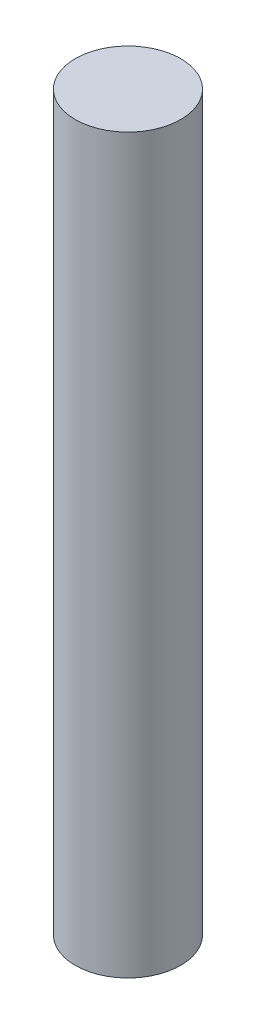
ISO-10303-21;
HEADER;
FILE_DESCRIPTION(('STEP AP214'),'2;1');
FILE_NAME('part.step','',(''),(''),'','','');
FILE_SCHEMA(('AUTOMOTIVE_DESIGN { 1 0 10303 214 1 1 1 1 }'));
ENDSEC;
DATA;
#1=APPLICATION_CONTEXT('core data for automotive mechanical design processes');
#2=APPLICATION_PROTOCOL_DEFINITION('international standard','automotive_design',2000,#1);
#3=PRODUCT_CONTEXT('',#1,'mechanical');
#4=PRODUCT('Part','Part','',(#3));
#5=PRODUCT_RELATED_PRODUCT_CATEGORY('part','',(#4));
#6=PRODUCT_DEFINITION_FORMATION('','',#4);
#7=PRODUCT_DEFINITION_CONTEXT('part definition',#1,'design');
#8=PRODUCT_DEFINITION('design','',#6,#7);
#9=PRODUCT_DEFINITION_SHAPE('','',#8);
#10=(LENGTH_UNIT() NAMED_UNIT(*) SI_UNIT(.MILLI.,.METRE.));
#11=(NAMED_UNIT(*) PLANE_ANGLE_UNIT() SI_UNIT($,.RADIAN.));
#12=(NAMED_UNIT(*) SI_UNIT($,.STERADIAN.) SOLID_ANGLE_UNIT());
#13=UNCERTAINTY_MEASURE_WITH_UNIT(LENGTH_MEASURE(1.E-05),#10,'distance_accuracy_value','');
#14=(GEOMETRIC_REPRESENTATION_CONTEXT(3) GLOBAL_UNCERTAINTY_ASSIGNED_CONTEXT((#13)) GLOBAL_UNIT_ASSIGNED_CONTEXT((#10,
#11,#12)) REPRESENTATION_CONTEXT('',''));
#15=CARTESIAN_POINT('',(0.,0.,0.));
#16=DIRECTION('',(0.,0.,1.));
#17=DIRECTION('',(1.,0.,0.));
#18=AXIS2_PLACEMENT_3D('',#15,#16,#17);
#19=CARTESIAN_POINT('',(0.,25.,0.));
#20=DIRECTION('',(0.,-1.,0.));
#21=DIRECTION('',(0.,0.,-1.));
#22=AXIS2_PLACEMENT_3D('',#19,#20,#21);
#23=CYLINDRICAL_SURFACE('',#22,1.8);
#24=CARTESIAN_POINT('',(0.,25.,0.));
#25=DIRECTION('',(0.,1.,0.));
#26=DIRECTION('',(0.,0.,1.));
#27=AXIS2_PLACEMENT_3D('',#24,#25,#26);
#28=CIRCLE('',#27,1.8);
#29=CARTESIAN_POINT('',(0.,25.,1.8));
#30=VERTEX_POINT('',#29);
#31=EDGE_CURVE('E10',#30,#30,#28,.T.);
#32=ORIENTED_EDGE('',*,*,#31,.F.);
#33=EDGE_LOOP('',(#32));
#34=FACE_BOUND('',#33,.T.);
#35=CARTESIAN_POINT('',(0.,0.,0.));
#36=DIRECTION('',(0.,1.,0.));
#37=DIRECTION('',(0.,0.,1.));
#38=AXIS2_PLACEMENT_3D('',#35,#36,#37);
#39=CIRCLE('',#38,1.8);
#40=CARTESIAN_POINT('',(0.,0.,1.8));
#41=VERTEX_POINT('',#40);
#42=EDGE_CURVE('E36',#41,#41,#39,.T.);
#43=ORIENTED_EDGE('',*,*,#42,.T.);
#44=EDGE_LOOP('',(#43));
#45=FACE_BOUND('',#44,.T.);
#46=ADVANCED_FACE('F33',(#34,#45),#23,.T.);
#47=CARTESIAN_POINT('',(0.,25.,0.));
#48=DIRECTION('',(0.,1.,0.));
#49=DIRECTION('',(0.,0.,1.));
#50=AXIS2_PLACEMENT_3D('',#47,#48,#49);
#51=PLANE('',#50);
#52=ORIENTED_EDGE('',*,*,#31,.T.);
#53=EDGE_LOOP('',(#52));
#54=FACE_BOUND('',#53,.T.);
#55=ADVANCED_FACE('F48',(#54),#51,.T.);
#56=CARTESIAN_POINT('',(0.,0.,0.));
#57=DIRECTION('',(0.,1.,0.));
#58=DIRECTION('',(0.,0.,1.));
#59=AXIS2_PLACEMENT_3D('',#56,#57,#58);
#60=PLANE('',#59);
#61=ORIENTED_EDGE('',*,*,#42,.F.);
#62=EDGE_LOOP('',(#61));
#63=FACE_BOUND('',#62,.T.);
#64=ADVANCED_FACE('F46',(#63),#60,.F.);
#65=CLOSED_SHELL('',(#46,#55,#64));
#66=MANIFOLD_SOLID_BREP('B2',#65);
#67=ADVANCED_BREP_SHAPE_REPRESENTATION('',(#18,#66),#14);
#68=SHAPE_DEFINITION_REPRESENTATION(#9,#67);
ENDSEC;
END-ISO-10303-21;
